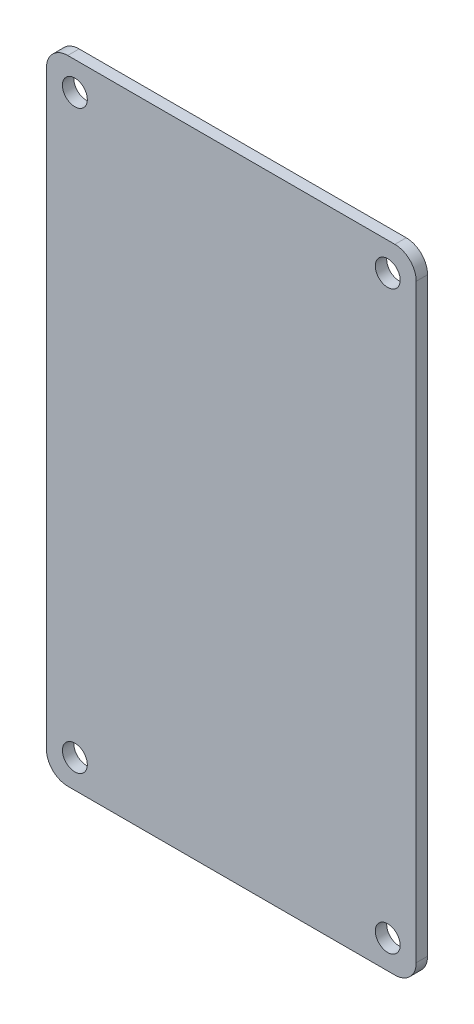
ISO-10303-21;
HEADER;
FILE_DESCRIPTION(('STEP AP214'),'2;1');
FILE_NAME('part.step','',(''),(''),'','','');
FILE_SCHEMA(('AUTOMOTIVE_DESIGN { 1 0 10303 214 1 1 1 1 }'));
ENDSEC;
DATA;
#1=APPLICATION_CONTEXT('core data for automotive mechanical design processes');
#2=APPLICATION_PROTOCOL_DEFINITION('international standard','automotive_design',2000,#1);
#3=PRODUCT_CONTEXT('',#1,'mechanical');
#4=PRODUCT('Part','Part','',(#3));
#5=PRODUCT_RELATED_PRODUCT_CATEGORY('part','',(#4));
#6=PRODUCT_DEFINITION_FORMATION('','',#4);
#7=PRODUCT_DEFINITION_CONTEXT('part definition',#1,'design');
#8=PRODUCT_DEFINITION('design','',#6,#7);
#9=PRODUCT_DEFINITION_SHAPE('','',#8);
#10=(LENGTH_UNIT() NAMED_UNIT(*) SI_UNIT(.MILLI.,.METRE.));
#11=(NAMED_UNIT(*) PLANE_ANGLE_UNIT() SI_UNIT($,.RADIAN.));
#12=(NAMED_UNIT(*) SI_UNIT($,.STERADIAN.) SOLID_ANGLE_UNIT());
#13=UNCERTAINTY_MEASURE_WITH_UNIT(LENGTH_MEASURE(1.E-05),#10,'distance_accuracy_value','');
#14=(GEOMETRIC_REPRESENTATION_CONTEXT(3) GLOBAL_UNCERTAINTY_ASSIGNED_CONTEXT((#13)) GLOBAL_UNIT_ASSIGNED_CONTEXT((#10,
#11,#12)) REPRESENTATION_CONTEXT('',''));
#15=CARTESIAN_POINT('',(0.,0.,0.));
#16=DIRECTION('',(0.,0.,1.));
#17=DIRECTION('',(1.,0.,0.));
#18=AXIS2_PLACEMENT_3D('',#15,#16,#17);
#19=CARTESIAN_POINT('',(0.,0.,1.6));
#20=DIRECTION('',(1.,0.,0.));
#21=DIRECTION('',(0.,0.,-1.));
#22=AXIS2_PLACEMENT_3D('',#19,#20,#21);
#23=PLANE('',#22);
#24=DIRECTION('',(0.,-1.,0.));
#25=VECTOR('',#24,1.);
#26=CARTESIAN_POINT('',(0.,0.,0.));
#27=LINE('',#26,#25);
#28=CARTESIAN_POINT('',(0.,86.,0.));
#29=VERTEX_POINT('',#28);
#30=CARTESIAN_POINT('',(0.,3.,0.));
#31=VERTEX_POINT('',#30);
#32=EDGE_CURVE('E125',#29,#31,#27,.T.);
#33=ORIENTED_EDGE('',*,*,#32,.T.);
#34=DIRECTION('',(0.,0.,-1.));
#35=VECTOR('',#34,1.);
#36=CARTESIAN_POINT('',(0.,3.,1.6));
#37=LINE('',#36,#35);
#38=CARTESIAN_POINT('',(0.,3.,1.6));
#39=VERTEX_POINT('',#38);
#40=EDGE_CURVE('E103',#31,#39,#37,.F.);
#41=ORIENTED_EDGE('',*,*,#40,.T.);
#42=DIRECTION('',(0.,-1.,0.));
#43=VECTOR('',#42,1.);
#44=CARTESIAN_POINT('',(0.,0.,1.6));
#45=LINE('',#44,#43);
#46=CARTESIAN_POINT('',(0.,86.,1.6));
#47=VERTEX_POINT('',#46);
#48=EDGE_CURVE('E135',#47,#39,#45,.T.);
#49=ORIENTED_EDGE('',*,*,#48,.F.);
#50=DIRECTION('',(0.,0.,-1.));
#51=VECTOR('',#50,1.);
#52=CARTESIAN_POINT('',(0.,86.,1.6));
#53=LINE('',#52,#51);
#54=EDGE_CURVE('E108',#47,#29,#53,.T.);
#55=ORIENTED_EDGE('',*,*,#54,.T.);
#56=EDGE_LOOP('',(#33,#41,#49,#55));
#57=FACE_BOUND('',#56,.T.);
#58=ADVANCED_FACE('F32',(#57),#23,.F.);
#59=CARTESIAN_POINT('',(0.,0.,1.6));
#60=DIRECTION('',(0.,1.,0.));
#61=DIRECTION('',(0.,0.,1.));
#62=AXIS2_PLACEMENT_3D('',#59,#60,#61);
#63=PLANE('',#62);
#64=DIRECTION('',(1.,0.,0.));
#65=VECTOR('',#64,1.);
#66=CARTESIAN_POINT('',(0.,0.,1.6));
#67=LINE('',#66,#65);
#68=CARTESIAN_POINT('',(3.,0.,1.6));
#69=VERTEX_POINT('',#68);
#70=CARTESIAN_POINT('',(49.,0.,1.6));
#71=VERTEX_POINT('',#70);
#72=EDGE_CURVE('E118',#69,#71,#67,.T.);
#73=ORIENTED_EDGE('',*,*,#72,.F.);
#74=DIRECTION('',(0.,0.,-1.));
#75=VECTOR('',#74,1.);
#76=CARTESIAN_POINT('',(3.,0.,1.6));
#77=LINE('',#76,#75);
#78=CARTESIAN_POINT('',(3.,0.,0.));
#79=VERTEX_POINT('',#78);
#80=EDGE_CURVE('E102',#69,#79,#77,.T.);
#81=ORIENTED_EDGE('',*,*,#80,.T.);
#82=DIRECTION('',(1.,0.,0.));
#83=VECTOR('',#82,1.);
#84=CARTESIAN_POINT('',(0.,0.,0.));
#85=LINE('',#84,#83);
#86=CARTESIAN_POINT('',(49.,0.,0.));
#87=VERTEX_POINT('',#86);
#88=EDGE_CURVE('E115',#79,#87,#85,.T.);
#89=ORIENTED_EDGE('',*,*,#88,.T.);
#90=DIRECTION('',(0.,0.,-1.));
#91=VECTOR('',#90,1.);
#92=CARTESIAN_POINT('',(49.,0.,1.6));
#93=LINE('',#92,#91);
#94=EDGE_CURVE('E120',#87,#71,#93,.F.);
#95=ORIENTED_EDGE('',*,*,#94,.T.);
#96=EDGE_LOOP('',(#73,#81,#89,#95));
#97=FACE_BOUND('',#96,.T.);
#98=ADVANCED_FACE('F114',(#97),#63,.F.);
#99=CARTESIAN_POINT('',(52.,0.,1.6));
#100=DIRECTION('',(-1.,0.,0.));
#101=DIRECTION('',(0.,0.,1.));
#102=AXIS2_PLACEMENT_3D('',#99,#100,#101);
#103=PLANE('',#102);
#104=DIRECTION('',(0.,1.,0.));
#105=VECTOR('',#104,1.);
#106=CARTESIAN_POINT('',(52.,0.,1.6));
#107=LINE('',#106,#105);
#108=CARTESIAN_POINT('',(52.,3.,1.6));
#109=VERTEX_POINT('',#108);
#110=CARTESIAN_POINT('',(52.,86.,1.6));
#111=VERTEX_POINT('',#110);
#112=EDGE_CURVE('E161',#109,#111,#107,.T.);
#113=ORIENTED_EDGE('',*,*,#112,.F.);
#114=DIRECTION('',(0.,0.,-1.));
#115=VECTOR('',#114,1.);
#116=CARTESIAN_POINT('',(52.,3.,1.6));
#117=LINE('',#116,#115);
#118=CARTESIAN_POINT('',(52.,3.,0.));
#119=VERTEX_POINT('',#118);
#120=EDGE_CURVE('E154',#109,#119,#117,.T.);
#121=ORIENTED_EDGE('',*,*,#120,.T.);
#122=DIRECTION('',(0.,1.,0.));
#123=VECTOR('',#122,1.);
#124=CARTESIAN_POINT('',(52.,0.,0.));
#125=LINE('',#124,#123);
#126=CARTESIAN_POINT('',(52.,86.,0.));
#127=VERTEX_POINT('',#126);
#128=EDGE_CURVE('E124',#119,#127,#125,.T.);
#129=ORIENTED_EDGE('',*,*,#128,.T.);
#130=DIRECTION('',(0.,0.,-1.));
#131=VECTOR('',#130,1.);
#132=CARTESIAN_POINT('',(52.,86.,1.6));
#133=LINE('',#132,#131);
#134=EDGE_CURVE('E152',#127,#111,#133,.F.);
#135=ORIENTED_EDGE('',*,*,#134,.T.);
#136=EDGE_LOOP('',(#113,#121,#129,#135));
#137=FACE_BOUND('',#136,.T.);
#138=ADVANCED_FACE('F159',(#137),#103,.F.);
#139=CARTESIAN_POINT('',(0.,89.,1.6));
#140=DIRECTION('',(0.,-1.,0.));
#141=DIRECTION('',(0.,0.,-1.));
#142=AXIS2_PLACEMENT_3D('',#139,#140,#141);
#143=PLANE('',#142);
#144=DIRECTION('',(-1.,0.,0.));
#145=VECTOR('',#144,1.);
#146=CARTESIAN_POINT('',(0.,89.,1.6));
#147=LINE('',#146,#145);
#148=CARTESIAN_POINT('',(49.,89.,1.6));
#149=VERTEX_POINT('',#148);
#150=CARTESIAN_POINT('',(3.,89.,1.6));
#151=VERTEX_POINT('',#150);
#152=EDGE_CURVE('E136',#149,#151,#147,.T.);
#153=ORIENTED_EDGE('',*,*,#152,.F.);
#154=DIRECTION('',(0.,0.,-1.));
#155=VECTOR('',#154,1.);
#156=CARTESIAN_POINT('',(49.,89.,1.6));
#157=LINE('',#156,#155);
#158=CARTESIAN_POINT('',(49.,89.,0.));
#159=VERTEX_POINT('',#158);
#160=EDGE_CURVE('E11',#149,#159,#157,.T.);
#161=ORIENTED_EDGE('',*,*,#160,.T.);
#162=DIRECTION('',(-1.,0.,0.));
#163=VECTOR('',#162,1.);
#164=CARTESIAN_POINT('',(0.,89.,0.));
#165=LINE('',#164,#163);
#166=CARTESIAN_POINT('',(3.,89.,0.));
#167=VERTEX_POINT('',#166);
#168=EDGE_CURVE('E128',#159,#167,#165,.T.);
#169=ORIENTED_EDGE('',*,*,#168,.T.);
#170=DIRECTION('',(0.,0.,-1.));
#171=VECTOR('',#170,1.);
#172=CARTESIAN_POINT('',(3.,89.,1.6));
#173=LINE('',#172,#171);
#174=EDGE_CURVE('E40',#167,#151,#173,.F.);
#175=ORIENTED_EDGE('',*,*,#174,.T.);
#176=EDGE_LOOP('',(#153,#161,#169,#175));
#177=FACE_BOUND('',#176,.T.);
#178=ADVANCED_FACE('F168',(#177),#143,.F.);
#179=CARTESIAN_POINT('',(0.,0.,1.6));
#180=DIRECTION('',(0.,0.,-1.));
#181=DIRECTION('',(-1.,0.,0.));
#182=AXIS2_PLACEMENT_3D('',#179,#180,#181);
#183=PLANE('',#182);
#184=CARTESIAN_POINT('',(48.,4.,1.6));
#185=DIRECTION('',(0.,0.,-1.));
#186=DIRECTION('',(-1.,0.,0.));
#187=AXIS2_PLACEMENT_3D('',#184,#185,#186);
#188=CIRCLE('',#187,1.75);
#189=CARTESIAN_POINT('',(46.25,4.,1.6));
#190=VERTEX_POINT('',#189);
#191=EDGE_CURVE('E180',#190,#190,#188,.T.);
#192=ORIENTED_EDGE('',*,*,#191,.T.);
#193=EDGE_LOOP('',(#192));
#194=FACE_BOUND('',#193,.T.);
#195=CARTESIAN_POINT('',(3.99999999999998,4.00000000000001,1.6));
#196=DIRECTION('',(0.,0.,-1.));
#197=DIRECTION('',(-1.,0.,0.));
#198=AXIS2_PLACEMENT_3D('',#195,#196,#197);
#199=CIRCLE('',#198,1.75);
#200=CARTESIAN_POINT('',(2.24999999999998,4.00000000000001,1.6));
#201=VERTEX_POINT('',#200);
#202=EDGE_CURVE('E183',#201,#201,#199,.T.);
#203=ORIENTED_EDGE('',*,*,#202,.T.);
#204=EDGE_LOOP('',(#203));
#205=FACE_BOUND('',#204,.T.);
#206=CARTESIAN_POINT('',(4.00000000000001,85.,1.6));
#207=DIRECTION('',(0.,0.,-1.));
#208=DIRECTION('',(-1.,0.,0.));
#209=AXIS2_PLACEMENT_3D('',#206,#207,#208);
#210=CIRCLE('',#209,1.75);
#211=CARTESIAN_POINT('',(2.25000000000001,85.,1.6));
#212=VERTEX_POINT('',#211);
#213=EDGE_CURVE('E186',#212,#212,#210,.T.);
#214=ORIENTED_EDGE('',*,*,#213,.T.);
#215=EDGE_LOOP('',(#214));
#216=FACE_BOUND('',#215,.T.);
#217=CARTESIAN_POINT('',(48.,85.,1.6));
#218=DIRECTION('',(0.,0.,-1.));
#219=DIRECTION('',(-1.,0.,0.));
#220=AXIS2_PLACEMENT_3D('',#217,#218,#219);
#221=CIRCLE('',#220,1.75);
#222=CARTESIAN_POINT('',(46.25,85.,1.6));
#223=VERTEX_POINT('',#222);
#224=EDGE_CURVE('E130',#223,#223,#221,.T.);
#225=ORIENTED_EDGE('',*,*,#224,.T.);
#226=EDGE_LOOP('',(#225));
#227=FACE_BOUND('',#226,.T.);
#228=ORIENTED_EDGE('',*,*,#48,.T.);
#229=CARTESIAN_POINT('',(3.,3.,1.6));
#230=DIRECTION('',(0.,0.,-1.));
#231=DIRECTION('',(-1.,0.,0.));
#232=AXIS2_PLACEMENT_3D('',#229,#230,#231);
#233=CIRCLE('',#232,3.);
#234=EDGE_CURVE('E150',#39,#69,#233,.F.);
#235=ORIENTED_EDGE('',*,*,#234,.T.);
#236=ORIENTED_EDGE('',*,*,#72,.T.);
#237=CARTESIAN_POINT('',(49.,3.,1.6));
#238=DIRECTION('',(0.,0.,-1.));
#239=DIRECTION('',(-1.,0.,0.));
#240=AXIS2_PLACEMENT_3D('',#237,#238,#239);
#241=CIRCLE('',#240,3.);
#242=EDGE_CURVE('E148',#71,#109,#241,.F.);
#243=ORIENTED_EDGE('',*,*,#242,.T.);
#244=ORIENTED_EDGE('',*,*,#112,.T.);
#245=CARTESIAN_POINT('',(49.,86.,1.6));
#246=DIRECTION('',(0.,0.,-1.));
#247=DIRECTION('',(-1.,0.,0.));
#248=AXIS2_PLACEMENT_3D('',#245,#246,#247);
#249=CIRCLE('',#248,3.);
#250=EDGE_CURVE('E53',#111,#149,#249,.F.);
#251=ORIENTED_EDGE('',*,*,#250,.T.);
#252=ORIENTED_EDGE('',*,*,#152,.T.);
#253=CARTESIAN_POINT('',(3.,86.,1.6));
#254=DIRECTION('',(0.,0.,-1.));
#255=DIRECTION('',(-1.,0.,0.));
#256=AXIS2_PLACEMENT_3D('',#253,#254,#255);
#257=CIRCLE('',#256,3.);
#258=EDGE_CURVE('E145',#151,#47,#257,.F.);
#259=ORIENTED_EDGE('',*,*,#258,.T.);
#260=EDGE_LOOP('',(#228,#235,#236,#243,#244,#251,#252,#259));
#261=FACE_BOUND('',#260,.T.);
#262=ADVANCED_FACE('F208',(#194,#205,#216,#227,#261),#183,.F.);
#263=CARTESIAN_POINT('',(0.,0.,0.));
#264=DIRECTION('',(0.,0.,-1.));
#265=DIRECTION('',(-1.,0.,0.));
#266=AXIS2_PLACEMENT_3D('',#263,#264,#265);
#267=PLANE('',#266);
#268=CARTESIAN_POINT('',(48.,4.,0.));
#269=DIRECTION('',(0.,0.,1.));
#270=DIRECTION('',(-1.,0.,0.));
#271=AXIS2_PLACEMENT_3D('',#268,#269,#270);
#272=CIRCLE('',#271,1.75);
#273=CARTESIAN_POINT('',(46.25,4.,0.));
#274=VERTEX_POINT('',#273);
#275=EDGE_CURVE('E189',#274,#274,#272,.T.);
#276=ORIENTED_EDGE('',*,*,#275,.T.);
#277=EDGE_LOOP('',(#276));
#278=FACE_BOUND('',#277,.T.);
#279=CARTESIAN_POINT('',(3.99999999999998,4.00000000000001,0.));
#280=DIRECTION('',(0.,0.,1.));
#281=DIRECTION('',(1.,0.,0.));
#282=AXIS2_PLACEMENT_3D('',#279,#280,#281);
#283=CIRCLE('',#282,1.75);
#284=CARTESIAN_POINT('',(5.74999999999999,4.00000000000001,0.));
#285=VERTEX_POINT('',#284);
#286=EDGE_CURVE('E193',#285,#285,#283,.T.);
#287=ORIENTED_EDGE('',*,*,#286,.T.);
#288=EDGE_LOOP('',(#287));
#289=FACE_BOUND('',#288,.T.);
#290=CARTESIAN_POINT('',(4.00000000000001,85.,0.));
#291=DIRECTION('',(0.,0.,1.));
#292=DIRECTION('',(-1.,0.,0.));
#293=AXIS2_PLACEMENT_3D('',#290,#291,#292);
#294=CIRCLE('',#293,1.75);
#295=CARTESIAN_POINT('',(2.25000000000001,85.,0.));
#296=VERTEX_POINT('',#295);
#297=EDGE_CURVE('E190',#296,#296,#294,.T.);
#298=ORIENTED_EDGE('',*,*,#297,.T.);
#299=EDGE_LOOP('',(#298));
#300=FACE_BOUND('',#299,.T.);
#301=CARTESIAN_POINT('',(48.,85.,0.));
#302=DIRECTION('',(0.,0.,1.));
#303=DIRECTION('',(1.,0.,0.));
#304=AXIS2_PLACEMENT_3D('',#301,#302,#303);
#305=CIRCLE('',#304,1.75);
#306=CARTESIAN_POINT('',(49.75,85.,0.));
#307=VERTEX_POINT('',#306);
#308=EDGE_CURVE('E177',#307,#307,#305,.T.);
#309=ORIENTED_EDGE('',*,*,#308,.T.);
#310=EDGE_LOOP('',(#309));
#311=FACE_BOUND('',#310,.T.);
#312=ORIENTED_EDGE('',*,*,#88,.F.);
#313=CARTESIAN_POINT('',(3.,3.,0.));
#314=DIRECTION('',(0.,0.,-1.));
#315=DIRECTION('',(-1.,0.,0.));
#316=AXIS2_PLACEMENT_3D('',#313,#314,#315);
#317=CIRCLE('',#316,3.);
#318=EDGE_CURVE('E98',#79,#31,#317,.T.);
#319=ORIENTED_EDGE('',*,*,#318,.T.);
#320=ORIENTED_EDGE('',*,*,#32,.F.);
#321=CARTESIAN_POINT('',(3.,86.,0.));
#322=DIRECTION('',(0.,0.,-1.));
#323=DIRECTION('',(-1.,0.,0.));
#324=AXIS2_PLACEMENT_3D('',#321,#322,#323);
#325=CIRCLE('',#324,3.);
#326=EDGE_CURVE('E119',#29,#167,#325,.T.);
#327=ORIENTED_EDGE('',*,*,#326,.T.);
#328=ORIENTED_EDGE('',*,*,#168,.F.);
#329=CARTESIAN_POINT('',(49.,86.,0.));
#330=DIRECTION('',(0.,0.,-1.));
#331=DIRECTION('',(-1.,0.,0.));
#332=AXIS2_PLACEMENT_3D('',#329,#330,#331);
#333=CIRCLE('',#332,3.);
#334=EDGE_CURVE('E139',#159,#127,#333,.T.);
#335=ORIENTED_EDGE('',*,*,#334,.T.);
#336=ORIENTED_EDGE('',*,*,#128,.F.);
#337=CARTESIAN_POINT('',(49.,3.,0.));
#338=DIRECTION('',(0.,0.,-1.));
#339=DIRECTION('',(-1.,0.,0.));
#340=AXIS2_PLACEMENT_3D('',#337,#338,#339);
#341=CIRCLE('',#340,3.);
#342=EDGE_CURVE('E109',#119,#87,#341,.T.);
#343=ORIENTED_EDGE('',*,*,#342,.T.);
#344=EDGE_LOOP('',(#312,#319,#320,#327,#328,#335,#336,#343));
#345=FACE_BOUND('',#344,.T.);
#346=ADVANCED_FACE('F122',(#278,#289,#300,#311,#345),#267,.T.);
#347=CARTESIAN_POINT('',(48.,85.,0.));
#348=DIRECTION('',(0.,0.,1.));
#349=DIRECTION('',(1.,0.,0.));
#350=AXIS2_PLACEMENT_3D('',#347,#348,#349);
#351=CYLINDRICAL_SURFACE('',#350,1.75);
#352=ORIENTED_EDGE('',*,*,#308,.F.);
#353=EDGE_LOOP('',(#352));
#354=FACE_BOUND('',#353,.T.);
#355=ORIENTED_EDGE('',*,*,#224,.F.);
#356=EDGE_LOOP('',(#355));
#357=FACE_BOUND('',#356,.T.);
#358=ADVANCED_FACE('F280',(#354,#357),#351,.F.);
#359=CARTESIAN_POINT('',(4.00000000000001,85.,0.));
#360=DIRECTION('',(0.,0.,1.));
#361=DIRECTION('',(1.,0.,0.));
#362=AXIS2_PLACEMENT_3D('',#359,#360,#361);
#363=CYLINDRICAL_SURFACE('',#362,1.75);
#364=ORIENTED_EDGE('',*,*,#297,.F.);
#365=EDGE_LOOP('',(#364));
#366=FACE_BOUND('',#365,.T.);
#367=ORIENTED_EDGE('',*,*,#213,.F.);
#368=EDGE_LOOP('',(#367));
#369=FACE_BOUND('',#368,.T.);
#370=ADVANCED_FACE('F271',(#366,#369),#363,.F.);
#371=CARTESIAN_POINT('',(3.99999999999998,4.00000000000001,0.));
#372=DIRECTION('',(0.,0.,1.));
#373=DIRECTION('',(1.,0.,0.));
#374=AXIS2_PLACEMENT_3D('',#371,#372,#373);
#375=CYLINDRICAL_SURFACE('',#374,1.75);
#376=ORIENTED_EDGE('',*,*,#286,.F.);
#377=EDGE_LOOP('',(#376));
#378=FACE_BOUND('',#377,.T.);
#379=ORIENTED_EDGE('',*,*,#202,.F.);
#380=EDGE_LOOP('',(#379));
#381=FACE_BOUND('',#380,.T.);
#382=ADVANCED_FACE('F204',(#378,#381),#375,.F.);
#383=CARTESIAN_POINT('',(48.,4.,0.));
#384=DIRECTION('',(0.,0.,1.));
#385=DIRECTION('',(1.,0.,0.));
#386=AXIS2_PLACEMENT_3D('',#383,#384,#385);
#387=CYLINDRICAL_SURFACE('',#386,1.75);
#388=ORIENTED_EDGE('',*,*,#275,.F.);
#389=EDGE_LOOP('',(#388));
#390=FACE_BOUND('',#389,.T.);
#391=ORIENTED_EDGE('',*,*,#191,.F.);
#392=EDGE_LOOP('',(#391));
#393=FACE_BOUND('',#392,.T.);
#394=ADVANCED_FACE('F201',(#390,#393),#387,.F.);
#395=CARTESIAN_POINT('',(3.,3.,1.6));
#396=DIRECTION('',(0.,0.,-1.));
#397=DIRECTION('',(-1.,0.,0.));
#398=AXIS2_PLACEMENT_3D('',#395,#396,#397);
#399=CYLINDRICAL_SURFACE('',#398,3.);
#400=ORIENTED_EDGE('',*,*,#234,.F.);
#401=ORIENTED_EDGE('',*,*,#40,.F.);
#402=ORIENTED_EDGE('',*,*,#318,.F.);
#403=ORIENTED_EDGE('',*,*,#80,.F.);
#404=EDGE_LOOP('',(#400,#401,#402,#403));
#405=FACE_BOUND('',#404,.T.);
#406=ADVANCED_FACE('F101',(#405),#399,.T.);
#407=CARTESIAN_POINT('',(49.,3.,1.6));
#408=DIRECTION('',(0.,0.,-1.));
#409=DIRECTION('',(-1.,0.,0.));
#410=AXIS2_PLACEMENT_3D('',#407,#408,#409);
#411=CYLINDRICAL_SURFACE('',#410,3.);
#412=ORIENTED_EDGE('',*,*,#242,.F.);
#413=ORIENTED_EDGE('',*,*,#94,.F.);
#414=ORIENTED_EDGE('',*,*,#342,.F.);
#415=ORIENTED_EDGE('',*,*,#120,.F.);
#416=EDGE_LOOP('',(#412,#413,#414,#415));
#417=FACE_BOUND('',#416,.T.);
#418=ADVANCED_FACE('F225',(#417),#411,.T.);
#419=CARTESIAN_POINT('',(49.,86.,1.6));
#420=DIRECTION('',(0.,0.,-1.));
#421=DIRECTION('',(-1.,0.,0.));
#422=AXIS2_PLACEMENT_3D('',#419,#420,#421);
#423=CYLINDRICAL_SURFACE('',#422,3.);
#424=ORIENTED_EDGE('',*,*,#250,.F.);
#425=ORIENTED_EDGE('',*,*,#134,.F.);
#426=ORIENTED_EDGE('',*,*,#334,.F.);
#427=ORIENTED_EDGE('',*,*,#160,.F.);
#428=EDGE_LOOP('',(#424,#425,#426,#427));
#429=FACE_BOUND('',#428,.T.);
#430=ADVANCED_FACE('F167',(#429),#423,.T.);
#431=CARTESIAN_POINT('',(3.,86.,1.6));
#432=DIRECTION('',(0.,0.,-1.));
#433=DIRECTION('',(-1.,0.,0.));
#434=AXIS2_PLACEMENT_3D('',#431,#432,#433);
#435=CYLINDRICAL_SURFACE('',#434,3.);
#436=ORIENTED_EDGE('',*,*,#258,.F.);
#437=ORIENTED_EDGE('',*,*,#174,.F.);
#438=ORIENTED_EDGE('',*,*,#326,.F.);
#439=ORIENTED_EDGE('',*,*,#54,.F.);
#440=EDGE_LOOP('',(#436,#437,#438,#439));
#441=FACE_BOUND('',#440,.T.);
#442=ADVANCED_FACE('F34',(#441),#435,.T.);
#443=CLOSED_SHELL('',(#58,#98,#138,#178,#262,#346,#358,#370,#382,#394,#406,#418,#430,#442));
#444=MANIFOLD_SOLID_BREP('B2',#443);
#445=ADVANCED_BREP_SHAPE_REPRESENTATION('',(#18,#444),#14);
#446=SHAPE_DEFINITION_REPRESENTATION(#9,#445);
ENDSEC;
END-ISO-10303-21;
